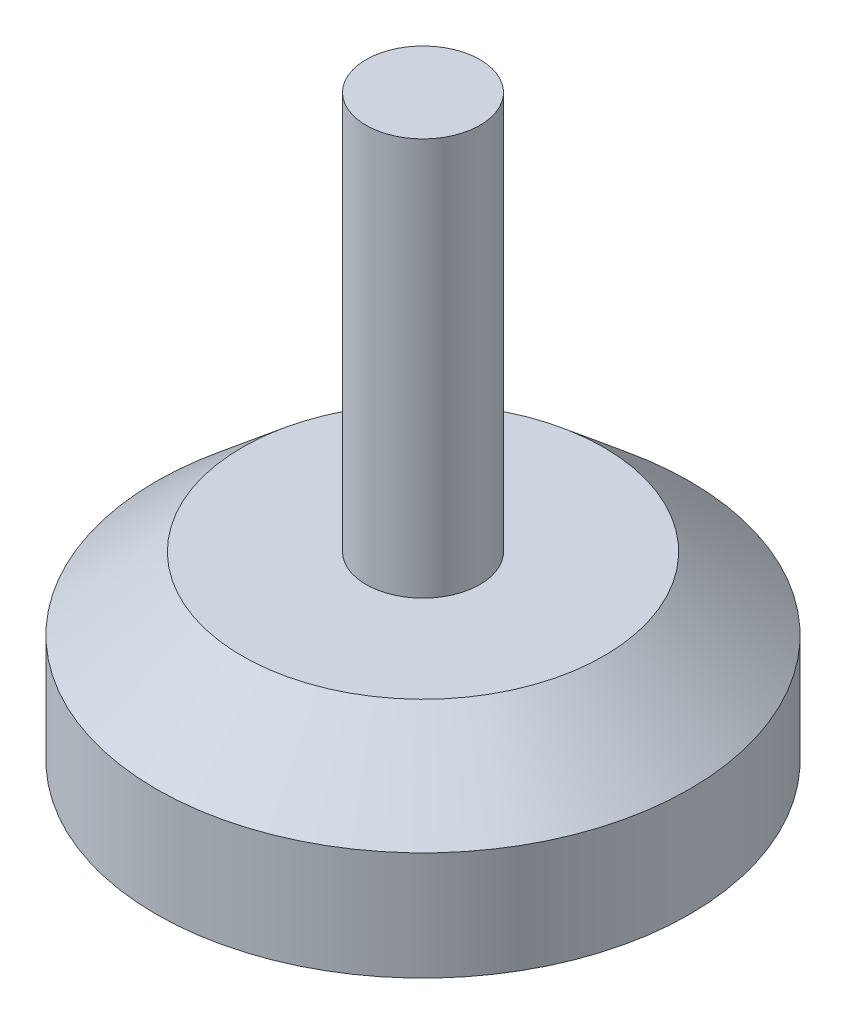
ISO-10303-21;
HEADER;
FILE_DESCRIPTION(('STEP AP214'),'2;1');
FILE_NAME('part.step','',(''),(''),'','','');
FILE_SCHEMA(('AUTOMOTIVE_DESIGN { 1 0 10303 214 1 1 1 1 }'));
ENDSEC;
DATA;
#1=APPLICATION_CONTEXT('core data for automotive mechanical design processes');
#2=APPLICATION_PROTOCOL_DEFINITION('international standard','automotive_design',2000,#1);
#3=PRODUCT_CONTEXT('',#1,'mechanical');
#4=PRODUCT('Part','Part','',(#3));
#5=PRODUCT_RELATED_PRODUCT_CATEGORY('part','',(#4));
#6=PRODUCT_DEFINITION_FORMATION('','',#4);
#7=PRODUCT_DEFINITION_CONTEXT('part definition',#1,'design');
#8=PRODUCT_DEFINITION('design','',#6,#7);
#9=PRODUCT_DEFINITION_SHAPE('','',#8);
#10=(LENGTH_UNIT() NAMED_UNIT(*) SI_UNIT(.MILLI.,.METRE.));
#11=(NAMED_UNIT(*) PLANE_ANGLE_UNIT() SI_UNIT($,.RADIAN.));
#12=(NAMED_UNIT(*) SI_UNIT($,.STERADIAN.) SOLID_ANGLE_UNIT());
#13=UNCERTAINTY_MEASURE_WITH_UNIT(LENGTH_MEASURE(1.E-05),#10,'distance_accuracy_value','');
#14=(GEOMETRIC_REPRESENTATION_CONTEXT(3) GLOBAL_UNCERTAINTY_ASSIGNED_CONTEXT((#13)) GLOBAL_UNIT_ASSIGNED_CONTEXT((#10,
#11,#12)) REPRESENTATION_CONTEXT('',''));
#15=CARTESIAN_POINT('',(0.,0.,0.));
#16=DIRECTION('',(0.,0.,1.));
#17=DIRECTION('',(1.,0.,0.));
#18=AXIS2_PLACEMENT_3D('',#15,#16,#17);
#19=CARTESIAN_POINT('',(0.,0.,0.));
#20=DIRECTION('',(0.,1.,0.));
#21=DIRECTION('',(0.,0.,1.));
#22=AXIS2_PLACEMENT_3D('',#19,#20,#21);
#23=PLANE('',#22);
#24=CARTESIAN_POINT('',(0.,0.,0.));
#25=DIRECTION('',(0.,-1.,0.));
#26=DIRECTION('',(0.,0.,-1.));
#27=AXIS2_PLACEMENT_3D('',#24,#25,#26);
#28=CIRCLE('',#27,14.75);
#29=CARTESIAN_POINT('',(0.,0.,-14.75));
#30=VERTEX_POINT('',#29);
#31=EDGE_CURVE('E10',#30,#30,#28,.T.);
#32=ORIENTED_EDGE('',*,*,#31,.T.);
#33=EDGE_LOOP('',(#32));
#34=FACE_BOUND('',#33,.T.);
#35=ADVANCED_FACE('F34',(#34),#23,.F.);
#36=CARTESIAN_POINT('',(0.,0.,0.));
#37=DIRECTION('',(0.,-1.,0.));
#38=DIRECTION('',(0.,0.,-1.));
#39=AXIS2_PLACEMENT_3D('',#36,#37,#38);
#40=CYLINDRICAL_SURFACE('',#39,14.75);
#41=ORIENTED_EDGE('',*,*,#31,.F.);
#42=EDGE_LOOP('',(#41));
#43=FACE_BOUND('',#42,.T.);
#44=CARTESIAN_POINT('',(0.,6.,0.));
#45=DIRECTION('',(0.,-1.,0.));
#46=DIRECTION('',(0.,0.,-1.));
#47=AXIS2_PLACEMENT_3D('',#44,#45,#46);
#48=CIRCLE('',#47,14.75);
#49=CARTESIAN_POINT('',(0.,6.,-14.75));
#50=VERTEX_POINT('',#49);
#51=EDGE_CURVE('E40',#50,#50,#48,.T.);
#52=ORIENTED_EDGE('',*,*,#51,.T.);
#53=EDGE_LOOP('',(#52));
#54=FACE_BOUND('',#53,.T.);
#55=ADVANCED_FACE('F69',(#43,#54),#40,.T.);
#56=CARTESIAN_POINT('',(0.,10.,0.));
#57=DIRECTION('',(0.,-1.,0.));
#58=DIRECTION('',(0.,0.,-1.));
#59=AXIS2_PLACEMENT_3D('',#56,#57,#58);
#60=CONICAL_SURFACE('',#59,10.,0.870903457075653);
#61=ORIENTED_EDGE('',*,*,#51,.F.);
#62=EDGE_LOOP('',(#61));
#63=FACE_BOUND('',#62,.T.);
#64=CARTESIAN_POINT('',(0.,10.,0.));
#65=DIRECTION('',(0.,-1.,0.));
#66=DIRECTION('',(0.,0.,-1.));
#67=AXIS2_PLACEMENT_3D('',#64,#65,#66);
#68=CIRCLE('',#67,10.);
#69=CARTESIAN_POINT('',(0.,10.,-10.));
#70=VERTEX_POINT('',#69);
#71=EDGE_CURVE('E44',#70,#70,#68,.T.);
#72=ORIENTED_EDGE('',*,*,#71,.T.);
#73=EDGE_LOOP('',(#72));
#74=FACE_BOUND('',#73,.T.);
#75=ADVANCED_FACE('F73',(#63,#74),#60,.T.);
#76=CARTESIAN_POINT('',(-10.,10.,0.));
#77=DIRECTION('',(0.,-1.,0.));
#78=DIRECTION('',(0.,0.,-1.));
#79=AXIS2_PLACEMENT_3D('',#76,#77,#78);
#80=PLANE('',#79);
#81=ORIENTED_EDGE('',*,*,#71,.F.);
#82=EDGE_LOOP('',(#81));
#83=FACE_BOUND('',#82,.T.);
#84=CARTESIAN_POINT('',(0.,10.,0.));
#85=DIRECTION('',(0.,-1.,0.));
#86=DIRECTION('',(0.,0.,-1.));
#87=AXIS2_PLACEMENT_3D('',#84,#85,#86);
#88=CIRCLE('',#87,3.15);
#89=CARTESIAN_POINT('',(0.,10.,-3.15));
#90=VERTEX_POINT('',#89);
#91=EDGE_CURVE('E48',#90,#90,#88,.T.);
#92=ORIENTED_EDGE('',*,*,#91,.T.);
#93=EDGE_LOOP('',(#92));
#94=FACE_BOUND('',#93,.T.);
#95=ADVANCED_FACE('F65',(#83,#94),#80,.F.);
#96=CARTESIAN_POINT('',(0.,0.,0.));
#97=DIRECTION('',(0.,-1.,0.));
#98=DIRECTION('',(0.,0.,-1.));
#99=AXIS2_PLACEMENT_3D('',#96,#97,#98);
#100=CYLINDRICAL_SURFACE('',#99,3.15);
#101=ORIENTED_EDGE('',*,*,#91,.F.);
#102=EDGE_LOOP('',(#101));
#103=FACE_BOUND('',#102,.T.);
#104=CARTESIAN_POINT('',(0.,32.,0.));
#105=DIRECTION('',(0.,-1.,0.));
#106=DIRECTION('',(0.,0.,-1.));
#107=AXIS2_PLACEMENT_3D('',#104,#105,#106);
#108=CIRCLE('',#107,3.15);
#109=CARTESIAN_POINT('',(0.,32.,-3.15));
#110=VERTEX_POINT('',#109);
#111=EDGE_CURVE('E53',#110,#110,#108,.T.);
#112=ORIENTED_EDGE('',*,*,#111,.T.);
#113=EDGE_LOOP('',(#112));
#114=FACE_BOUND('',#113,.T.);
#115=ADVANCED_FACE('F57',(#103,#114),#100,.T.);
#116=CARTESIAN_POINT('',(0.,32.,0.));
#117=DIRECTION('',(0.,-1.,0.));
#118=DIRECTION('',(0.,0.,-1.));
#119=AXIS2_PLACEMENT_3D('',#116,#117,#118);
#120=PLANE('',#119);
#121=ORIENTED_EDGE('',*,*,#111,.F.);
#122=EDGE_LOOP('',(#121));
#123=FACE_BOUND('',#122,.T.);
#124=ADVANCED_FACE('F59',(#123),#120,.F.);
#125=CLOSED_SHELL('',(#35,#55,#75,#95,#115,#124));
#126=MANIFOLD_SOLID_BREP('B2',#125);
#127=ADVANCED_BREP_SHAPE_REPRESENTATION('',(#18,#126),#14);
#128=SHAPE_DEFINITION_REPRESENTATION(#9,#127);
ENDSEC;
END-ISO-10303-21;
